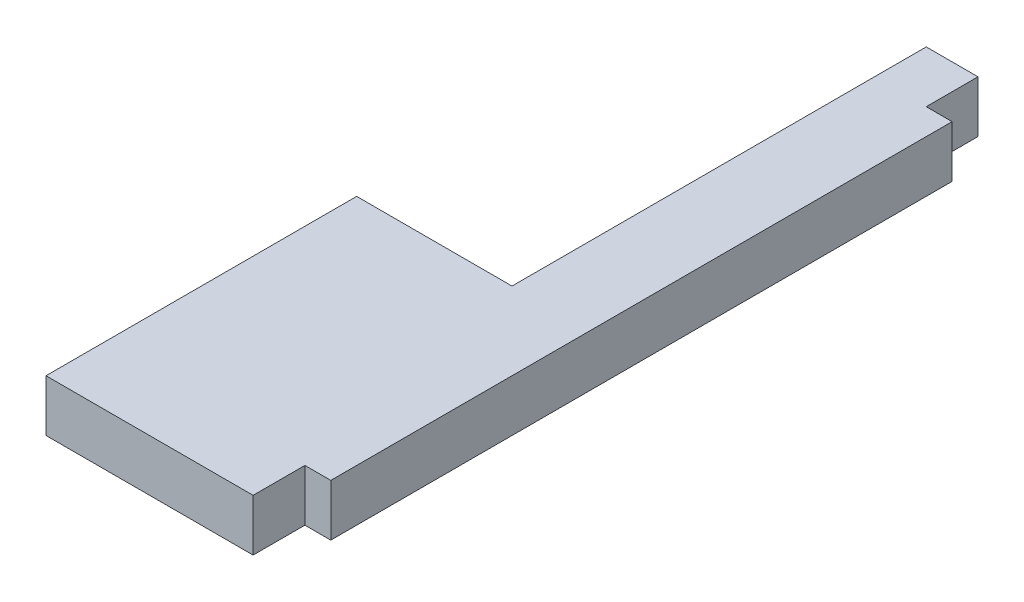
ISO-10303-21;
HEADER;
FILE_DESCRIPTION(('STEP AP214'),'2;1');
FILE_NAME('part.step','',(''),(''),'','','');
FILE_SCHEMA(('AUTOMOTIVE_DESIGN { 1 0 10303 214 1 1 1 1 }'));
ENDSEC;
DATA;
#1=APPLICATION_CONTEXT('core data for automotive mechanical design processes');
#2=APPLICATION_PROTOCOL_DEFINITION('international standard','automotive_design',2000,#1);
#3=PRODUCT_CONTEXT('',#1,'mechanical');
#4=PRODUCT('Part','Part','',(#3));
#5=PRODUCT_RELATED_PRODUCT_CATEGORY('part','',(#4));
#6=PRODUCT_DEFINITION_FORMATION('','',#4);
#7=PRODUCT_DEFINITION_CONTEXT('part definition',#1,'design');
#8=PRODUCT_DEFINITION('design','',#6,#7);
#9=PRODUCT_DEFINITION_SHAPE('','',#8);
#10=(LENGTH_UNIT() NAMED_UNIT(*) SI_UNIT(.MILLI.,.METRE.));
#11=(NAMED_UNIT(*) PLANE_ANGLE_UNIT() SI_UNIT($,.RADIAN.));
#12=(NAMED_UNIT(*) SI_UNIT($,.STERADIAN.) SOLID_ANGLE_UNIT());
#13=UNCERTAINTY_MEASURE_WITH_UNIT(LENGTH_MEASURE(1.E-05),#10,'distance_accuracy_value','');
#14=(GEOMETRIC_REPRESENTATION_CONTEXT(3) GLOBAL_UNCERTAINTY_ASSIGNED_CONTEXT((#13)) GLOBAL_UNIT_ASSIGNED_CONTEXT((#10,
#11,#12)) REPRESENTATION_CONTEXT('',''));
#15=CARTESIAN_POINT('',(0.,0.,0.));
#16=DIRECTION('',(0.,0.,1.));
#17=DIRECTION('',(1.,0.,0.));
#18=AXIS2_PLACEMENT_3D('',#15,#16,#17);
#19=CARTESIAN_POINT('',(0.,10.,0.));
#20=DIRECTION('',(1.,0.,0.));
#21=DIRECTION('',(0.,0.,-1.));
#22=AXIS2_PLACEMENT_3D('',#19,#20,#21);
#23=PLANE('',#22);
#24=DIRECTION('',(0.,0.,1.));
#25=VECTOR('',#24,1.);
#26=CARTESIAN_POINT('',(0.,0.,0.));
#27=LINE('',#26,#25);
#28=CARTESIAN_POINT('',(0.,0.,-60.));
#29=VERTEX_POINT('',#28);
#30=CARTESIAN_POINT('',(0.,0.,0.));
#31=VERTEX_POINT('',#30);
#32=EDGE_CURVE('E141',#29,#31,#27,.T.);
#33=ORIENTED_EDGE('',*,*,#32,.T.);
#34=DIRECTION('',(0.,-1.,0.));
#35=VECTOR('',#34,1.);
#36=CARTESIAN_POINT('',(0.,10.,0.));
#37=LINE('',#36,#35);
#38=CARTESIAN_POINT('',(0.,10.,0.));
#39=VERTEX_POINT('',#38);
#40=EDGE_CURVE('E11',#39,#31,#37,.T.);
#41=ORIENTED_EDGE('',*,*,#40,.F.);
#42=DIRECTION('',(0.,0.,1.));
#43=VECTOR('',#42,1.);
#44=CARTESIAN_POINT('',(0.,10.,0.));
#45=LINE('',#44,#43);
#46=CARTESIAN_POINT('',(0.,10.,-60.));
#47=VERTEX_POINT('',#46);
#48=EDGE_CURVE('E159',#47,#39,#45,.T.);
#49=ORIENTED_EDGE('',*,*,#48,.F.);
#50=DIRECTION('',(0.,-1.,0.));
#51=VECTOR('',#50,1.);
#52=CARTESIAN_POINT('',(0.,10.,-60.));
#53=LINE('',#52,#51);
#54=EDGE_CURVE('E137',#47,#29,#53,.T.);
#55=ORIENTED_EDGE('',*,*,#54,.T.);
#56=EDGE_LOOP('',(#33,#41,#49,#55));
#57=FACE_BOUND('',#56,.T.);
#58=ADVANCED_FACE('F33',(#57),#23,.F.);
#59=CARTESIAN_POINT('',(0.,10.,0.));
#60=DIRECTION('',(0.,0.,-1.));
#61=DIRECTION('',(-1.,0.,0.));
#62=AXIS2_PLACEMENT_3D('',#59,#60,#61);
#63=PLANE('',#62);
#64=DIRECTION('',(1.,0.,0.));
#65=VECTOR('',#64,1.);
#66=CARTESIAN_POINT('',(0.,0.,0.));
#67=LINE('',#66,#65);
#68=CARTESIAN_POINT('',(40.,0.,0.));
#69=VERTEX_POINT('',#68);
#70=EDGE_CURVE('E144',#31,#69,#67,.T.);
#71=ORIENTED_EDGE('',*,*,#70,.T.);
#72=DIRECTION('',(0.,-1.,0.));
#73=VECTOR('',#72,1.);
#74=CARTESIAN_POINT('',(40.,10.,0.));
#75=LINE('',#74,#73);
#76=CARTESIAN_POINT('',(40.,10.,0.));
#77=VERTEX_POINT('',#76);
#78=EDGE_CURVE('E41',#77,#69,#75,.T.);
#79=ORIENTED_EDGE('',*,*,#78,.F.);
#80=DIRECTION('',(1.,0.,0.));
#81=VECTOR('',#80,1.);
#82=CARTESIAN_POINT('',(0.,10.,0.));
#83=LINE('',#82,#81);
#84=EDGE_CURVE('E98',#39,#77,#83,.T.);
#85=ORIENTED_EDGE('',*,*,#84,.F.);
#86=ORIENTED_EDGE('',*,*,#40,.T.);
#87=EDGE_LOOP('',(#71,#79,#85,#86));
#88=FACE_BOUND('',#87,.T.);
#89=ADVANCED_FACE('F208',(#88),#63,.F.);
#90=CARTESIAN_POINT('',(40.,10.,0.));
#91=DIRECTION('',(-1.,0.,0.));
#92=DIRECTION('',(0.,0.,1.));
#93=AXIS2_PLACEMENT_3D('',#90,#91,#92);
#94=PLANE('',#93);
#95=DIRECTION('',(0.,0.,-1.));
#96=VECTOR('',#95,1.);
#97=CARTESIAN_POINT('',(40.,0.,0.));
#98=LINE('',#97,#96);
#99=CARTESIAN_POINT('',(40.,0.,-10.));
#100=VERTEX_POINT('',#99);
#101=EDGE_CURVE('E146',#69,#100,#98,.T.);
#102=ORIENTED_EDGE('',*,*,#101,.T.);
#103=DIRECTION('',(0.,-1.,0.));
#104=VECTOR('',#103,1.);
#105=CARTESIAN_POINT('',(40.,10.,-10.));
#106=LINE('',#105,#104);
#107=CARTESIAN_POINT('',(40.,10.,-10.));
#108=VERTEX_POINT('',#107);
#109=EDGE_CURVE('E172',#108,#100,#106,.T.);
#110=ORIENTED_EDGE('',*,*,#109,.F.);
#111=DIRECTION('',(0.,0.,-1.));
#112=VECTOR('',#111,1.);
#113=CARTESIAN_POINT('',(40.,10.,0.));
#114=LINE('',#113,#112);
#115=EDGE_CURVE('E180',#77,#108,#114,.T.);
#116=ORIENTED_EDGE('',*,*,#115,.F.);
#117=ORIENTED_EDGE('',*,*,#78,.T.);
#118=EDGE_LOOP('',(#102,#110,#116,#117));
#119=FACE_BOUND('',#118,.T.);
#120=ADVANCED_FACE('F178',(#119),#94,.F.);
#121=CARTESIAN_POINT('',(40.,10.,-10.));
#122=DIRECTION('',(0.,0.,-1.));
#123=DIRECTION('',(-1.,0.,0.));
#124=AXIS2_PLACEMENT_3D('',#121,#122,#123);
#125=PLANE('',#124);
#126=DIRECTION('',(1.,0.,0.));
#127=VECTOR('',#126,1.);
#128=CARTESIAN_POINT('',(40.,0.,-10.));
#129=LINE('',#128,#127);
#130=CARTESIAN_POINT('',(45.,0.,-10.));
#131=VERTEX_POINT('',#130);
#132=EDGE_CURVE('E148',#100,#131,#129,.T.);
#133=ORIENTED_EDGE('',*,*,#132,.T.);
#134=DIRECTION('',(0.,-1.,0.));
#135=VECTOR('',#134,1.);
#136=CARTESIAN_POINT('',(45.,10.,-10.));
#137=LINE('',#136,#135);
#138=CARTESIAN_POINT('',(45.,10.,-10.));
#139=VERTEX_POINT('',#138);
#140=EDGE_CURVE('E169',#139,#131,#137,.T.);
#141=ORIENTED_EDGE('',*,*,#140,.F.);
#142=DIRECTION('',(1.,0.,0.));
#143=VECTOR('',#142,1.);
#144=CARTESIAN_POINT('',(40.,10.,-10.));
#145=LINE('',#144,#143);
#146=EDGE_CURVE('E198',#108,#139,#145,.T.);
#147=ORIENTED_EDGE('',*,*,#146,.F.);
#148=ORIENTED_EDGE('',*,*,#109,.T.);
#149=EDGE_LOOP('',(#133,#141,#147,#148));
#150=FACE_BOUND('',#149,.T.);
#151=ADVANCED_FACE('F189',(#150),#125,.F.);
#152=CARTESIAN_POINT('',(45.,10.,-10.));
#153=DIRECTION('',(-1.,0.,0.));
#154=DIRECTION('',(0.,0.,1.));
#155=AXIS2_PLACEMENT_3D('',#152,#153,#154);
#156=PLANE('',#155);
#157=DIRECTION('',(0.,0.,-1.));
#158=VECTOR('',#157,1.);
#159=CARTESIAN_POINT('',(45.,0.,-10.));
#160=LINE('',#159,#158);
#161=CARTESIAN_POINT('',(45.,0.,-130.));
#162=VERTEX_POINT('',#161);
#163=EDGE_CURVE('E150',#131,#162,#160,.T.);
#164=ORIENTED_EDGE('',*,*,#163,.T.);
#165=DIRECTION('',(0.,-1.,0.));
#166=VECTOR('',#165,1.);
#167=CARTESIAN_POINT('',(45.,10.,-130.));
#168=LINE('',#167,#166);
#169=CARTESIAN_POINT('',(45.,10.,-130.));
#170=VERTEX_POINT('',#169);
#171=EDGE_CURVE('E166',#170,#162,#168,.T.);
#172=ORIENTED_EDGE('',*,*,#171,.F.);
#173=DIRECTION('',(0.,0.,-1.));
#174=VECTOR('',#173,1.);
#175=CARTESIAN_POINT('',(45.,10.,-10.));
#176=LINE('',#175,#174);
#177=EDGE_CURVE('E195',#139,#170,#176,.T.);
#178=ORIENTED_EDGE('',*,*,#177,.F.);
#179=ORIENTED_EDGE('',*,*,#140,.T.);
#180=EDGE_LOOP('',(#164,#172,#178,#179));
#181=FACE_BOUND('',#180,.T.);
#182=ADVANCED_FACE('F193',(#181),#156,.F.);
#183=CARTESIAN_POINT('',(45.,10.,-130.));
#184=DIRECTION('',(0.,0.,1.));
#185=DIRECTION('',(1.,0.,0.));
#186=AXIS2_PLACEMENT_3D('',#183,#184,#185);
#187=PLANE('',#186);
#188=DIRECTION('',(-1.,0.,0.));
#189=VECTOR('',#188,1.);
#190=CARTESIAN_POINT('',(45.,0.,-130.));
#191=LINE('',#190,#189);
#192=CARTESIAN_POINT('',(40.,0.,-130.));
#193=VERTEX_POINT('',#192);
#194=EDGE_CURVE('E152',#162,#193,#191,.T.);
#195=ORIENTED_EDGE('',*,*,#194,.T.);
#196=DIRECTION('',(0.,-1.,0.));
#197=VECTOR('',#196,1.);
#198=CARTESIAN_POINT('',(40.,10.,-130.));
#199=LINE('',#198,#197);
#200=CARTESIAN_POINT('',(40.,10.,-130.));
#201=VERTEX_POINT('',#200);
#202=EDGE_CURVE('E163',#201,#193,#199,.T.);
#203=ORIENTED_EDGE('',*,*,#202,.F.);
#204=DIRECTION('',(-1.,0.,0.));
#205=VECTOR('',#204,1.);
#206=CARTESIAN_POINT('',(45.,10.,-130.));
#207=LINE('',#206,#205);
#208=EDGE_CURVE('E197',#170,#201,#207,.T.);
#209=ORIENTED_EDGE('',*,*,#208,.F.);
#210=ORIENTED_EDGE('',*,*,#171,.T.);
#211=EDGE_LOOP('',(#195,#203,#209,#210));
#212=FACE_BOUND('',#211,.T.);
#213=ADVANCED_FACE('F220',(#212),#187,.F.);
#214=CARTESIAN_POINT('',(40.,10.,-130.));
#215=DIRECTION('',(-1.,0.,0.));
#216=DIRECTION('',(0.,0.,1.));
#217=AXIS2_PLACEMENT_3D('',#214,#215,#216);
#218=PLANE('',#217);
#219=DIRECTION('',(0.,0.,-1.));
#220=VECTOR('',#219,1.);
#221=CARTESIAN_POINT('',(40.,0.,-130.));
#222=LINE('',#221,#220);
#223=CARTESIAN_POINT('',(40.,0.,-140.));
#224=VERTEX_POINT('',#223);
#225=EDGE_CURVE('E154',#193,#224,#222,.T.);
#226=ORIENTED_EDGE('',*,*,#225,.T.);
#227=DIRECTION('',(0.,-1.,0.));
#228=VECTOR('',#227,1.);
#229=CARTESIAN_POINT('',(40.,10.,-140.));
#230=LINE('',#229,#228);
#231=CARTESIAN_POINT('',(40.,10.,-140.));
#232=VERTEX_POINT('',#231);
#233=EDGE_CURVE('E132',#232,#224,#230,.T.);
#234=ORIENTED_EDGE('',*,*,#233,.F.);
#235=DIRECTION('',(0.,0.,-1.));
#236=VECTOR('',#235,1.);
#237=CARTESIAN_POINT('',(40.,10.,-130.));
#238=LINE('',#237,#236);
#239=EDGE_CURVE('E123',#201,#232,#238,.T.);
#240=ORIENTED_EDGE('',*,*,#239,.F.);
#241=ORIENTED_EDGE('',*,*,#202,.T.);
#242=EDGE_LOOP('',(#226,#234,#240,#241));
#243=FACE_BOUND('',#242,.T.);
#244=ADVANCED_FACE('F223',(#243),#218,.F.);
#245=CARTESIAN_POINT('',(40.,10.,-140.));
#246=DIRECTION('',(0.,0.,1.));
#247=DIRECTION('',(1.,0.,0.));
#248=AXIS2_PLACEMENT_3D('',#245,#246,#247);
#249=PLANE('',#248);
#250=DIRECTION('',(-1.,0.,0.));
#251=VECTOR('',#250,1.);
#252=CARTESIAN_POINT('',(40.,0.,-140.));
#253=LINE('',#252,#251);
#254=CARTESIAN_POINT('',(30.,0.,-140.));
#255=VERTEX_POINT('',#254);
#256=EDGE_CURVE('E131',#224,#255,#253,.T.);
#257=ORIENTED_EDGE('',*,*,#256,.T.);
#258=DIRECTION('',(0.,-1.,0.));
#259=VECTOR('',#258,1.);
#260=CARTESIAN_POINT('',(30.,10.,-140.));
#261=LINE('',#260,#259);
#262=CARTESIAN_POINT('',(30.,10.,-140.));
#263=VERTEX_POINT('',#262);
#264=EDGE_CURVE('E128',#263,#255,#261,.T.);
#265=ORIENTED_EDGE('',*,*,#264,.F.);
#266=DIRECTION('',(-1.,0.,0.));
#267=VECTOR('',#266,1.);
#268=CARTESIAN_POINT('',(40.,10.,-140.));
#269=LINE('',#268,#267);
#270=EDGE_CURVE('E117',#232,#263,#269,.T.);
#271=ORIENTED_EDGE('',*,*,#270,.F.);
#272=ORIENTED_EDGE('',*,*,#233,.T.);
#273=EDGE_LOOP('',(#257,#265,#271,#272));
#274=FACE_BOUND('',#273,.T.);
#275=ADVANCED_FACE('F129',(#274),#249,.F.);
#276=CARTESIAN_POINT('',(30.,10.,-140.));
#277=DIRECTION('',(1.,0.,0.));
#278=DIRECTION('',(0.,0.,-1.));
#279=AXIS2_PLACEMENT_3D('',#276,#277,#278);
#280=PLANE('',#279);
#281=DIRECTION('',(0.,0.,1.));
#282=VECTOR('',#281,1.);
#283=CARTESIAN_POINT('',(30.,0.,-140.));
#284=LINE('',#283,#282);
#285=CARTESIAN_POINT('',(30.,0.,-60.));
#286=VERTEX_POINT('',#285);
#287=EDGE_CURVE('E84',#255,#286,#284,.T.);
#288=ORIENTED_EDGE('',*,*,#287,.T.);
#289=DIRECTION('',(0.,-1.,0.));
#290=VECTOR('',#289,1.);
#291=CARTESIAN_POINT('',(30.,10.,-60.));
#292=LINE('',#291,#290);
#293=CARTESIAN_POINT('',(30.,10.,-60.));
#294=VERTEX_POINT('',#293);
#295=EDGE_CURVE('E133',#294,#286,#292,.T.);
#296=ORIENTED_EDGE('',*,*,#295,.F.);
#297=DIRECTION('',(0.,0.,1.));
#298=VECTOR('',#297,1.);
#299=CARTESIAN_POINT('',(30.,10.,-140.));
#300=LINE('',#299,#298);
#301=EDGE_CURVE('E121',#263,#294,#300,.T.);
#302=ORIENTED_EDGE('',*,*,#301,.F.);
#303=ORIENTED_EDGE('',*,*,#264,.T.);
#304=EDGE_LOOP('',(#288,#296,#302,#303));
#305=FACE_BOUND('',#304,.T.);
#306=ADVANCED_FACE('F135',(#305),#280,.F.);
#307=CARTESIAN_POINT('',(30.,10.,-60.));
#308=DIRECTION('',(0.,0.,1.));
#309=DIRECTION('',(1.,0.,0.));
#310=AXIS2_PLACEMENT_3D('',#307,#308,#309);
#311=PLANE('',#310);
#312=DIRECTION('',(-1.,0.,0.));
#313=VECTOR('',#312,1.);
#314=CARTESIAN_POINT('',(30.,0.,-60.));
#315=LINE('',#314,#313);
#316=EDGE_CURVE('E90',#286,#29,#315,.T.);
#317=ORIENTED_EDGE('',*,*,#316,.T.);
#318=ORIENTED_EDGE('',*,*,#54,.F.);
#319=DIRECTION('',(-1.,0.,0.));
#320=VECTOR('',#319,1.);
#321=CARTESIAN_POINT('',(30.,10.,-60.));
#322=LINE('',#321,#320);
#323=EDGE_CURVE('E49',#294,#47,#322,.T.);
#324=ORIENTED_EDGE('',*,*,#323,.F.);
#325=ORIENTED_EDGE('',*,*,#295,.T.);
#326=EDGE_LOOP('',(#317,#318,#324,#325));
#327=FACE_BOUND('',#326,.T.);
#328=ADVANCED_FACE('F232',(#327),#311,.F.);
#329=CARTESIAN_POINT('',(0.,10.,0.));
#330=DIRECTION('',(0.,1.,0.));
#331=DIRECTION('',(0.,0.,1.));
#332=AXIS2_PLACEMENT_3D('',#329,#330,#331);
#333=PLANE('',#332);
#334=ORIENTED_EDGE('',*,*,#48,.T.);
#335=ORIENTED_EDGE('',*,*,#84,.T.);
#336=ORIENTED_EDGE('',*,*,#115,.T.);
#337=ORIENTED_EDGE('',*,*,#146,.T.);
#338=ORIENTED_EDGE('',*,*,#177,.T.);
#339=ORIENTED_EDGE('',*,*,#208,.T.);
#340=ORIENTED_EDGE('',*,*,#239,.T.);
#341=ORIENTED_EDGE('',*,*,#270,.T.);
#342=ORIENTED_EDGE('',*,*,#301,.T.);
#343=ORIENTED_EDGE('',*,*,#323,.T.);
#344=EDGE_LOOP('',(#334,#335,#336,#337,#338,#339,#340,#341,#342,#343));
#345=FACE_BOUND('',#344,.T.);
#346=ADVANCED_FACE('F119',(#345),#333,.T.);
#347=CARTESIAN_POINT('',(0.,0.,0.));
#348=DIRECTION('',(0.,1.,0.));
#349=DIRECTION('',(0.,0.,1.));
#350=AXIS2_PLACEMENT_3D('',#347,#348,#349);
#351=PLANE('',#350);
#352=ORIENTED_EDGE('',*,*,#32,.F.);
#353=ORIENTED_EDGE('',*,*,#316,.F.);
#354=ORIENTED_EDGE('',*,*,#287,.F.);
#355=ORIENTED_EDGE('',*,*,#256,.F.);
#356=ORIENTED_EDGE('',*,*,#225,.F.);
#357=ORIENTED_EDGE('',*,*,#194,.F.);
#358=ORIENTED_EDGE('',*,*,#163,.F.);
#359=ORIENTED_EDGE('',*,*,#132,.F.);
#360=ORIENTED_EDGE('',*,*,#101,.F.);
#361=ORIENTED_EDGE('',*,*,#70,.F.);
#362=EDGE_LOOP('',(#352,#353,#354,#355,#356,#357,#358,#359,#360,#361));
#363=FACE_BOUND('',#362,.T.);
#364=ADVANCED_FACE('F184',(#363),#351,.F.);
#365=CLOSED_SHELL('',(#58,#89,#120,#151,#182,#213,#244,#275,#306,#328,#346,#364));
#366=MANIFOLD_SOLID_BREP('B2',#365);
#367=ADVANCED_BREP_SHAPE_REPRESENTATION('',(#18,#366),#14);
#368=SHAPE_DEFINITION_REPRESENTATION(#9,#367);
ENDSEC;
END-ISO-10303-21;
